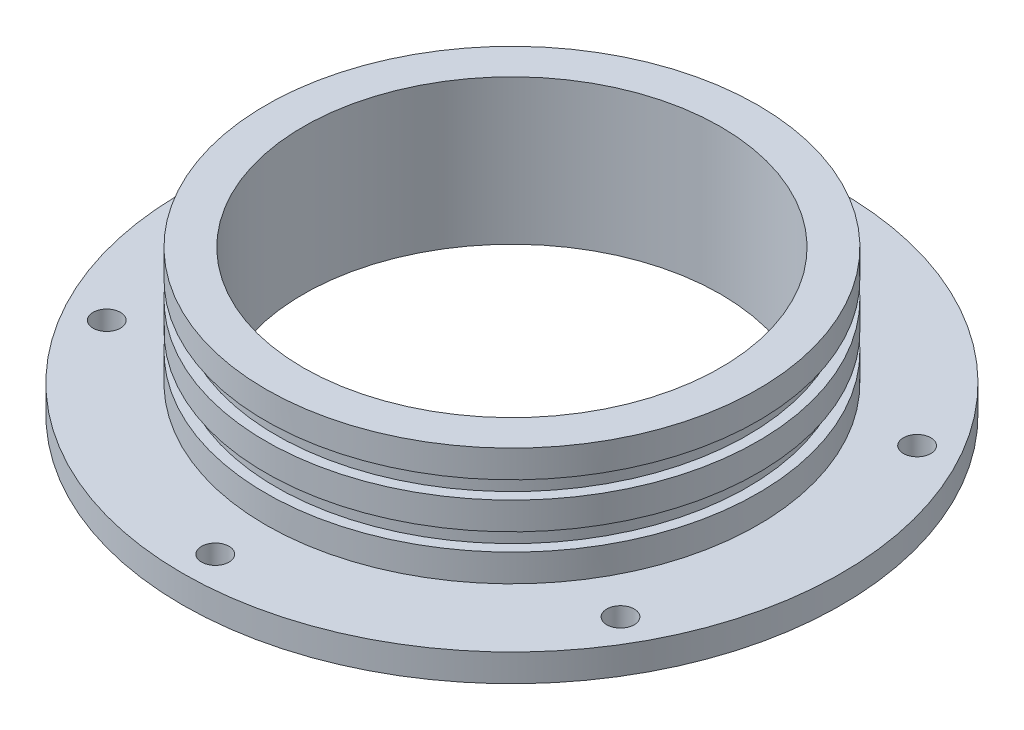
ISO-10303-21;
HEADER;
FILE_DESCRIPTION(('STEP AP214'),'2;1');
FILE_NAME('part.step','',(''),(''),'','','');
FILE_SCHEMA(('AUTOMOTIVE_DESIGN { 1 0 10303 214 1 1 1 1 }'));
ENDSEC;
DATA;
#1=APPLICATION_CONTEXT('core data for automotive mechanical design processes');
#2=APPLICATION_PROTOCOL_DEFINITION('international standard','automotive_design',2000,#1);
#3=PRODUCT_CONTEXT('',#1,'mechanical');
#4=PRODUCT('Part','Part','',(#3));
#5=PRODUCT_RELATED_PRODUCT_CATEGORY('part','',(#4));
#6=PRODUCT_DEFINITION_FORMATION('','',#4);
#7=PRODUCT_DEFINITION_CONTEXT('part definition',#1,'design');
#8=PRODUCT_DEFINITION('design','',#6,#7);
#9=PRODUCT_DEFINITION_SHAPE('','',#8);
#10=(LENGTH_UNIT() NAMED_UNIT(*) SI_UNIT(.MILLI.,.METRE.));
#11=(NAMED_UNIT(*) PLANE_ANGLE_UNIT() SI_UNIT($,.RADIAN.));
#12=(NAMED_UNIT(*) SI_UNIT($,.STERADIAN.) SOLID_ANGLE_UNIT());
#13=UNCERTAINTY_MEASURE_WITH_UNIT(LENGTH_MEASURE(1.E-05),#10,'distance_accuracy_value','');
#14=(GEOMETRIC_REPRESENTATION_CONTEXT(3) GLOBAL_UNCERTAINTY_ASSIGNED_CONTEXT((#13)) GLOBAL_UNIT_ASSIGNED_CONTEXT((#10,
#11,#12)) REPRESENTATION_CONTEXT('',''));
#15=CARTESIAN_POINT('',(0.,0.,0.));
#16=DIRECTION('',(0.,0.,1.));
#17=DIRECTION('',(1.,0.,0.));
#18=AXIS2_PLACEMENT_3D('',#15,#16,#17);
#19=CARTESIAN_POINT('',(0.,26.4,0.));
#20=DIRECTION('',(0.,-1.,0.));
#21=DIRECTION('',(0.,0.,-1.));
#22=AXIS2_PLACEMENT_3D('',#19,#20,#21);
#23=CYLINDRICAL_SURFACE('',#22,44.8);
#24=CARTESIAN_POINT('',(0.,10.,0.));
#25=DIRECTION('',(0.,-1.,0.));
#26=DIRECTION('',(0.,0.,-1.));
#27=AXIS2_PLACEMENT_3D('',#24,#25,#26);
#28=CIRCLE('',#27,44.8);
#29=CARTESIAN_POINT('',(0.,10.,-44.8));
#30=VERTEX_POINT('',#29);
#31=EDGE_CURVE('E48',#30,#30,#28,.T.);
#32=ORIENTED_EDGE('',*,*,#31,.T.);
#33=EDGE_LOOP('',(#32));
#34=FACE_BOUND('',#33,.T.);
#35=CARTESIAN_POINT('',(0.,5.,0.));
#36=DIRECTION('',(0.,1.,0.));
#37=DIRECTION('',(0.,0.,1.));
#38=AXIS2_PLACEMENT_3D('',#35,#36,#37);
#39=CIRCLE('',#38,44.8);
#40=CARTESIAN_POINT('',(0.,5.,44.8));
#41=VERTEX_POINT('',#40);
#42=EDGE_CURVE('E67',#41,#41,#39,.T.);
#43=ORIENTED_EDGE('',*,*,#42,.T.);
#44=EDGE_LOOP('',(#43));
#45=FACE_BOUND('',#44,.T.);
#46=ADVANCED_FACE('F44',(#34,#45),#23,.T.);
#47=CARTESIAN_POINT('',(0.,26.4,0.));
#48=DIRECTION('',(0.,1.,0.));
#49=DIRECTION('',(0.,0.,1.));
#50=AXIS2_PLACEMENT_3D('',#47,#48,#49);
#51=CIRCLE('',#50,44.8);
#52=CARTESIAN_POINT('',(0.,26.4,44.8));
#53=VERTEX_POINT('',#52);
#54=EDGE_CURVE('E81',#53,#53,#51,.T.);
#55=ORIENTED_EDGE('',*,*,#54,.F.);
#56=EDGE_LOOP('',(#55));
#57=FACE_BOUND('',#56,.T.);
#58=CARTESIAN_POINT('',(0.,21.4,0.));
#59=DIRECTION('',(0.,-1.,0.));
#60=DIRECTION('',(0.,0.,-1.));
#61=AXIS2_PLACEMENT_3D('',#58,#59,#60);
#62=CIRCLE('',#61,44.8);
#63=CARTESIAN_POINT('',(0.,21.4,-44.8));
#64=VERTEX_POINT('',#63);
#65=EDGE_CURVE('E61',#64,#64,#62,.T.);
#66=ORIENTED_EDGE('',*,*,#65,.F.);
#67=EDGE_LOOP('',(#66));
#68=FACE_BOUND('',#67,.T.);
#69=ADVANCED_FACE('F90',(#57,#68),#23,.T.);
#70=CARTESIAN_POINT('',(0.,5.,0.));
#71=DIRECTION('',(0.,1.,0.));
#72=DIRECTION('',(0.,0.,1.));
#73=AXIS2_PLACEMENT_3D('',#70,#71,#72);
#74=PLANE('',#73);
#75=CARTESIAN_POINT('',(0.,5.,54.));
#76=DIRECTION('',(0.,1.,0.));
#77=DIRECTION('',(0.,0.,1.));
#78=AXIS2_PLACEMENT_3D('',#75,#76,#77);
#79=CIRCLE('',#78,2.5);
#80=CARTESIAN_POINT('',(0.,5.,56.5));
#81=VERTEX_POINT('',#80);
#82=EDGE_CURVE('E137',#81,#81,#79,.T.);
#83=ORIENTED_EDGE('',*,*,#82,.F.);
#84=EDGE_LOOP('',(#83));
#85=FACE_BOUND('',#84,.T.);
#86=CARTESIAN_POINT('',(46.7653718043612,5.,27.0000000000027));
#87=DIRECTION('',(0.,1.,0.));
#88=DIRECTION('',(0.,0.,1.));
#89=AXIS2_PLACEMENT_3D('',#86,#87,#88);
#90=CIRCLE('',#89,2.50000000000083);
#91=CARTESIAN_POINT('',(46.7653718043612,5.,29.5000000000035));
#92=VERTEX_POINT('',#91);
#93=EDGE_CURVE('E140',#92,#92,#90,.T.);
#94=ORIENTED_EDGE('',*,*,#93,.F.);
#95=EDGE_LOOP('',(#94));
#96=FACE_BOUND('',#95,.T.);
#97=CARTESIAN_POINT('',(46.7653718043643,5.,-26.9999999999973));
#98=DIRECTION('',(0.,1.,0.));
#99=DIRECTION('',(0.,0.,1.));
#100=AXIS2_PLACEMENT_3D('',#97,#98,#99);
#101=CIRCLE('',#100,2.50000000000387);
#102=CARTESIAN_POINT('',(46.7653718043643,5.,-24.4999999999935));
#103=VERTEX_POINT('',#102);
#104=EDGE_CURVE('E143',#103,#103,#101,.T.);
#105=ORIENTED_EDGE('',*,*,#104,.F.);
#106=EDGE_LOOP('',(#105));
#107=FACE_BOUND('',#106,.T.);
#108=CARTESIAN_POINT('',(6.12586305153647E-12,5.,-54.));
#109=DIRECTION('',(0.,1.,0.));
#110=DIRECTION('',(0.,0.,1.));
#111=AXIS2_PLACEMENT_3D('',#108,#109,#110);
#112=CIRCLE('',#111,2.50000000000622);
#113=CARTESIAN_POINT('',(6.12586305153647E-12,5.,-51.4999999999938));
#114=VERTEX_POINT('',#113);
#115=EDGE_CURVE('E146',#114,#114,#112,.T.);
#116=ORIENTED_EDGE('',*,*,#115,.F.);
#117=EDGE_LOOP('',(#116));
#118=FACE_BOUND('',#117,.T.);
#119=CARTESIAN_POINT('',(-46.7653718043551,5.,-27.0000000000027));
#120=DIRECTION('',(0.,1.,0.));
#121=DIRECTION('',(0.,0.,1.));
#122=AXIS2_PLACEMENT_3D('',#119,#120,#121);
#123=CIRCLE('',#122,2.50000000000566);
#124=CARTESIAN_POINT('',(-46.7653718043551,5.,-24.499999999997));
#125=VERTEX_POINT('',#124);
#126=EDGE_CURVE('E149',#125,#125,#123,.T.);
#127=ORIENTED_EDGE('',*,*,#126,.F.);
#128=EDGE_LOOP('',(#127));
#129=FACE_BOUND('',#128,.T.);
#130=CARTESIAN_POINT('',(-46.7653718043582,5.,26.9999999999973));
#131=DIRECTION('',(0.,1.,0.));
#132=DIRECTION('',(0.,0.,1.));
#133=AXIS2_PLACEMENT_3D('',#130,#131,#132);
#134=CIRCLE('',#133,2.50000000000288);
#135=CARTESIAN_POINT('',(-46.7653718043582,5.,29.5000000000002));
#136=VERTEX_POINT('',#135);
#137=EDGE_CURVE('E152',#136,#136,#134,.T.);
#138=ORIENTED_EDGE('',*,*,#137,.F.);
#139=EDGE_LOOP('',(#138));
#140=FACE_BOUND('',#139,.T.);
#141=ORIENTED_EDGE('',*,*,#42,.F.);
#142=EDGE_LOOP('',(#141));
#143=FACE_BOUND('',#142,.T.);
#144=CARTESIAN_POINT('',(0.,5.,0.));
#145=DIRECTION('',(0.,1.,0.));
#146=DIRECTION('',(0.,0.,1.));
#147=AXIS2_PLACEMENT_3D('',#144,#145,#146);
#148=CIRCLE('',#147,60.);
#149=CARTESIAN_POINT('',(0.,5.,60.));
#150=VERTEX_POINT('',#149);
#151=EDGE_CURVE('E12',#150,#150,#148,.T.);
#152=ORIENTED_EDGE('',*,*,#151,.T.);
#153=EDGE_LOOP('',(#152));
#154=FACE_BOUND('',#153,.T.);
#155=ADVANCED_FACE('F87',(#85,#96,#107,#118,#129,#140,#143,#154),#74,.T.);
#156=CARTESIAN_POINT('',(0.,0.,0.));
#157=DIRECTION('',(0.,1.,0.));
#158=DIRECTION('',(0.,0.,1.));
#159=AXIS2_PLACEMENT_3D('',#156,#157,#158);
#160=PLANE('',#159);
#161=CARTESIAN_POINT('',(0.,0.,54.));
#162=DIRECTION('',(0.,-1.,0.));
#163=DIRECTION('',(0.,0.,-1.));
#164=AXIS2_PLACEMENT_3D('',#161,#162,#163);
#165=CIRCLE('',#164,2.5);
#166=CARTESIAN_POINT('',(0.,0.,51.5));
#167=VERTEX_POINT('',#166);
#168=EDGE_CURVE('E159',#167,#167,#165,.T.);
#169=ORIENTED_EDGE('',*,*,#168,.F.);
#170=EDGE_LOOP('',(#169));
#171=FACE_BOUND('',#170,.T.);
#172=CARTESIAN_POINT('',(46.7653718043612,0.,27.0000000000027));
#173=DIRECTION('',(0.,-1.,0.));
#174=DIRECTION('',(0.,0.,-1.));
#175=AXIS2_PLACEMENT_3D('',#172,#173,#174);
#176=CIRCLE('',#175,2.50000000000083);
#177=CARTESIAN_POINT('',(46.7653718043612,0.,24.5000000000018));
#178=VERTEX_POINT('',#177);
#179=EDGE_CURVE('E162',#178,#178,#176,.T.);
#180=ORIENTED_EDGE('',*,*,#179,.F.);
#181=EDGE_LOOP('',(#180));
#182=FACE_BOUND('',#181,.T.);
#183=CARTESIAN_POINT('',(46.7653718043643,0.,-26.9999999999973));
#184=DIRECTION('',(0.,-1.,0.));
#185=DIRECTION('',(0.,0.,-1.));
#186=AXIS2_PLACEMENT_3D('',#183,#184,#185);
#187=CIRCLE('',#186,2.50000000000387);
#188=CARTESIAN_POINT('',(46.7653718043643,0.,-29.5000000000012));
#189=VERTEX_POINT('',#188);
#190=EDGE_CURVE('E165',#189,#189,#187,.T.);
#191=ORIENTED_EDGE('',*,*,#190,.F.);
#192=EDGE_LOOP('',(#191));
#193=FACE_BOUND('',#192,.T.);
#194=CARTESIAN_POINT('',(6.12586305153647E-12,0.,-54.));
#195=DIRECTION('',(0.,-1.,0.));
#196=DIRECTION('',(0.,0.,-1.));
#197=AXIS2_PLACEMENT_3D('',#194,#195,#196);
#198=CIRCLE('',#197,2.50000000000622);
#199=CARTESIAN_POINT('',(6.12586305153647E-12,0.,-56.5000000000062));
#200=VERTEX_POINT('',#199);
#201=EDGE_CURVE('E168',#200,#200,#198,.T.);
#202=ORIENTED_EDGE('',*,*,#201,.F.);
#203=EDGE_LOOP('',(#202));
#204=FACE_BOUND('',#203,.T.);
#205=CARTESIAN_POINT('',(-46.7653718043551,0.,-27.0000000000027));
#206=DIRECTION('',(0.,-1.,0.));
#207=DIRECTION('',(0.,0.,-1.));
#208=AXIS2_PLACEMENT_3D('',#205,#206,#207);
#209=CIRCLE('',#208,2.50000000000566);
#210=CARTESIAN_POINT('',(-46.7653718043551,0.,-29.5000000000083));
#211=VERTEX_POINT('',#210);
#212=EDGE_CURVE('E158',#211,#211,#209,.T.);
#213=ORIENTED_EDGE('',*,*,#212,.F.);
#214=EDGE_LOOP('',(#213));
#215=FACE_BOUND('',#214,.T.);
#216=CARTESIAN_POINT('',(-46.7653718043582,0.,26.9999999999973));
#217=DIRECTION('',(0.,-1.,0.));
#218=DIRECTION('',(0.,0.,-1.));
#219=AXIS2_PLACEMENT_3D('',#216,#217,#218);
#220=CIRCLE('',#219,2.50000000000288);
#221=CARTESIAN_POINT('',(-46.7653718043582,0.,24.4999999999944));
#222=VERTEX_POINT('',#221);
#223=EDGE_CURVE('E155',#222,#222,#220,.T.);
#224=ORIENTED_EDGE('',*,*,#223,.F.);
#225=EDGE_LOOP('',(#224));
#226=FACE_BOUND('',#225,.T.);
#227=CARTESIAN_POINT('',(0.,0.,0.));
#228=DIRECTION('',(0.,1.,0.));
#229=DIRECTION('',(0.,0.,1.));
#230=AXIS2_PLACEMENT_3D('',#227,#228,#229);
#231=CIRCLE('',#230,60.);
#232=CARTESIAN_POINT('',(0.,0.,60.));
#233=VERTEX_POINT('',#232);
#234=EDGE_CURVE('E52',#233,#233,#231,.T.);
#235=ORIENTED_EDGE('',*,*,#234,.F.);
#236=EDGE_LOOP('',(#235));
#237=FACE_BOUND('',#236,.T.);
#238=CARTESIAN_POINT('',(0.,0.,0.));
#239=DIRECTION('',(0.,1.,0.));
#240=DIRECTION('',(0.,0.,1.));
#241=AXIS2_PLACEMENT_3D('',#238,#239,#240);
#242=CIRCLE('',#241,38.);
#243=CARTESIAN_POINT('',(0.,0.,38.));
#244=VERTEX_POINT('',#243);
#245=EDGE_CURVE('E57',#244,#244,#242,.T.);
#246=ORIENTED_EDGE('',*,*,#245,.T.);
#247=EDGE_LOOP('',(#246));
#248=FACE_BOUND('',#247,.T.);
#249=ADVANCED_FACE('F89',(#171,#182,#193,#204,#215,#226,#237,#248),#160,.F.);
#250=CARTESIAN_POINT('',(0.,5.,0.));
#251=DIRECTION('',(0.,-1.,0.));
#252=DIRECTION('',(0.,0.,-1.));
#253=AXIS2_PLACEMENT_3D('',#250,#251,#252);
#254=CYLINDRICAL_SURFACE('',#253,60.);
#255=ORIENTED_EDGE('',*,*,#151,.F.);
#256=EDGE_LOOP('',(#255));
#257=FACE_BOUND('',#256,.T.);
#258=ORIENTED_EDGE('',*,*,#234,.T.);
#259=EDGE_LOOP('',(#258));
#260=FACE_BOUND('',#259,.T.);
#261=ADVANCED_FACE('F46',(#257,#260),#254,.T.);
#262=CARTESIAN_POINT('',(0.,5.,0.));
#263=DIRECTION('',(0.,-1.,0.));
#264=DIRECTION('',(0.,0.,-1.));
#265=AXIS2_PLACEMENT_3D('',#262,#263,#264);
#266=CYLINDRICAL_SURFACE('',#265,38.);
#267=ORIENTED_EDGE('',*,*,#245,.F.);
#268=EDGE_LOOP('',(#267));
#269=FACE_BOUND('',#268,.T.);
#270=CARTESIAN_POINT('',(0.,26.4,0.));
#271=DIRECTION('',(0.,1.,0.));
#272=DIRECTION('',(0.,0.,1.));
#273=AXIS2_PLACEMENT_3D('',#270,#271,#272);
#274=CIRCLE('',#273,38.);
#275=CARTESIAN_POINT('',(0.,26.4,38.));
#276=VERTEX_POINT('',#275);
#277=EDGE_CURVE('E78',#276,#276,#274,.F.);
#278=ORIENTED_EDGE('',*,*,#277,.F.);
#279=EDGE_LOOP('',(#278));
#280=FACE_BOUND('',#279,.T.);
#281=ADVANCED_FACE('F184',(#269,#280),#266,.F.);
#282=CARTESIAN_POINT('',(0.,26.4,0.));
#283=DIRECTION('',(0.,1.,0.));
#284=DIRECTION('',(0.,0.,1.));
#285=AXIS2_PLACEMENT_3D('',#282,#283,#284);
#286=PLANE('',#285);
#287=ORIENTED_EDGE('',*,*,#277,.T.);
#288=EDGE_LOOP('',(#287));
#289=FACE_BOUND('',#288,.T.);
#290=ORIENTED_EDGE('',*,*,#54,.T.);
#291=EDGE_LOOP('',(#290));
#292=FACE_BOUND('',#291,.T.);
#293=ADVANCED_FACE('F187',(#289,#292),#286,.T.);
#294=CARTESIAN_POINT('',(0.,18.2,0.));
#295=DIRECTION('',(0.,1.,0.));
#296=DIRECTION('',(0.,0.,1.));
#297=AXIS2_PLACEMENT_3D('',#294,#295,#296);
#298=PLANE('',#297);
#299=CARTESIAN_POINT('',(0.,18.2,0.));
#300=DIRECTION('',(0.,-1.,0.));
#301=DIRECTION('',(0.,0.,-1.));
#302=AXIS2_PLACEMENT_3D('',#299,#300,#301);
#303=CIRCLE('',#302,42.9);
#304=CARTESIAN_POINT('',(0.,18.2,-42.9));
#305=VERTEX_POINT('',#304);
#306=EDGE_CURVE('E129',#305,#305,#303,.T.);
#307=ORIENTED_EDGE('',*,*,#306,.T.);
#308=EDGE_LOOP('',(#307));
#309=FACE_BOUND('',#308,.T.);
#310=CARTESIAN_POINT('',(0.,18.2,0.));
#311=DIRECTION('',(0.,-1.,0.));
#312=DIRECTION('',(0.,0.,-1.));
#313=AXIS2_PLACEMENT_3D('',#310,#311,#312);
#314=CIRCLE('',#313,44.8);
#315=CARTESIAN_POINT('',(0.,18.2,-44.8));
#316=VERTEX_POINT('',#315);
#317=EDGE_CURVE('E125',#316,#316,#314,.T.);
#318=ORIENTED_EDGE('',*,*,#317,.F.);
#319=EDGE_LOOP('',(#318));
#320=FACE_BOUND('',#319,.T.);
#321=ADVANCED_FACE('F192',(#309,#320),#298,.T.);
#322=CARTESIAN_POINT('',(0.,0.,0.));
#323=DIRECTION('',(0.,-1.,0.));
#324=DIRECTION('',(0.,0.,-1.));
#325=AXIS2_PLACEMENT_3D('',#322,#323,#324);
#326=CYLINDRICAL_SURFACE('',#325,42.9);
#327=CARTESIAN_POINT('',(0.,21.4,0.));
#328=DIRECTION('',(0.,-1.,0.));
#329=DIRECTION('',(0.,0.,-1.));
#330=AXIS2_PLACEMENT_3D('',#327,#328,#329);
#331=CIRCLE('',#330,42.9);
#332=CARTESIAN_POINT('',(0.,21.4,-42.9));
#333=VERTEX_POINT('',#332);
#334=EDGE_CURVE('E134',#333,#333,#331,.T.);
#335=ORIENTED_EDGE('',*,*,#334,.T.);
#336=EDGE_LOOP('',(#335));
#337=FACE_BOUND('',#336,.T.);
#338=ORIENTED_EDGE('',*,*,#306,.F.);
#339=EDGE_LOOP('',(#338));
#340=FACE_BOUND('',#339,.T.);
#341=ADVANCED_FACE('F119',(#337,#340),#326,.T.);
#342=CARTESIAN_POINT('',(0.,21.4,0.));
#343=DIRECTION('',(0.,-1.,0.));
#344=DIRECTION('',(0.,0.,-1.));
#345=AXIS2_PLACEMENT_3D('',#342,#343,#344);
#346=PLANE('',#345);
#347=ORIENTED_EDGE('',*,*,#334,.F.);
#348=EDGE_LOOP('',(#347));
#349=FACE_BOUND('',#348,.T.);
#350=ORIENTED_EDGE('',*,*,#65,.T.);
#351=EDGE_LOOP('',(#350));
#352=FACE_BOUND('',#351,.T.);
#353=ADVANCED_FACE('F111',(#349,#352),#346,.T.);
#354=ORIENTED_EDGE('',*,*,#317,.T.);
#355=EDGE_LOOP('',(#354));
#356=FACE_BOUND('',#355,.T.);
#357=CARTESIAN_POINT('',(0.,13.2,0.));
#358=DIRECTION('',(0.,-1.,0.));
#359=DIRECTION('',(0.,0.,-1.));
#360=AXIS2_PLACEMENT_3D('',#357,#358,#359);
#361=CIRCLE('',#360,44.8);
#362=CARTESIAN_POINT('',(0.,13.2,-44.8));
#363=VERTEX_POINT('',#362);
#364=EDGE_CURVE('E74',#363,#363,#361,.T.);
#365=ORIENTED_EDGE('',*,*,#364,.F.);
#366=EDGE_LOOP('',(#365));
#367=FACE_BOUND('',#366,.T.);
#368=ADVANCED_FACE('F100',(#356,#367),#23,.T.);
#369=CARTESIAN_POINT('',(0.,10.,0.));
#370=DIRECTION('',(0.,-1.,0.));
#371=DIRECTION('',(0.,0.,-1.));
#372=AXIS2_PLACEMENT_3D('',#369,#370,#371);
#373=PLANE('',#372);
#374=CARTESIAN_POINT('',(0.,10.,0.));
#375=DIRECTION('',(0.,-1.,0.));
#376=DIRECTION('',(0.,0.,-1.));
#377=AXIS2_PLACEMENT_3D('',#374,#375,#376);
#378=CIRCLE('',#377,42.9);
#379=CARTESIAN_POINT('',(0.,10.,-42.9));
#380=VERTEX_POINT('',#379);
#381=EDGE_CURVE('E63',#380,#380,#378,.T.);
#382=ORIENTED_EDGE('',*,*,#381,.T.);
#383=EDGE_LOOP('',(#382));
#384=FACE_BOUND('',#383,.T.);
#385=ORIENTED_EDGE('',*,*,#31,.F.);
#386=EDGE_LOOP('',(#385));
#387=FACE_BOUND('',#386,.T.);
#388=ADVANCED_FACE('F110',(#384,#387),#373,.F.);
#389=CARTESIAN_POINT('',(0.,0.,0.));
#390=DIRECTION('',(0.,-1.,0.));
#391=DIRECTION('',(0.,0.,-1.));
#392=AXIS2_PLACEMENT_3D('',#389,#390,#391);
#393=CYLINDRICAL_SURFACE('',#392,42.9);
#394=CARTESIAN_POINT('',(0.,13.2,0.));
#395=DIRECTION('',(0.,-1.,0.));
#396=DIRECTION('',(0.,0.,-1.));
#397=AXIS2_PLACEMENT_3D('',#394,#395,#396);
#398=CIRCLE('',#397,42.9);
#399=CARTESIAN_POINT('',(0.,13.2,-42.9));
#400=VERTEX_POINT('',#399);
#401=EDGE_CURVE('E69',#400,#400,#398,.T.);
#402=ORIENTED_EDGE('',*,*,#401,.T.);
#403=EDGE_LOOP('',(#402));
#404=FACE_BOUND('',#403,.T.);
#405=ORIENTED_EDGE('',*,*,#381,.F.);
#406=EDGE_LOOP('',(#405));
#407=FACE_BOUND('',#406,.T.);
#408=ADVANCED_FACE('F117',(#404,#407),#393,.T.);
#409=CARTESIAN_POINT('',(0.,13.2,0.));
#410=DIRECTION('',(0.,-1.,0.));
#411=DIRECTION('',(0.,0.,-1.));
#412=AXIS2_PLACEMENT_3D('',#409,#410,#411);
#413=PLANE('',#412);
#414=ORIENTED_EDGE('',*,*,#364,.T.);
#415=EDGE_LOOP('',(#414));
#416=FACE_BOUND('',#415,.T.);
#417=ORIENTED_EDGE('',*,*,#401,.F.);
#418=EDGE_LOOP('',(#417));
#419=FACE_BOUND('',#418,.T.);
#420=ADVANCED_FACE('F203',(#416,#419),#413,.T.);
#421=CARTESIAN_POINT('',(-46.7653718043582,20.,26.9999999999973));
#422=DIRECTION('',(0.,-1.,0.));
#423=DIRECTION('',(0.,0.,-1.));
#424=AXIS2_PLACEMENT_3D('',#421,#422,#423);
#425=CYLINDRICAL_SURFACE('',#424,2.50000000000288);
#426=ORIENTED_EDGE('',*,*,#137,.T.);
#427=EDGE_LOOP('',(#426));
#428=FACE_BOUND('',#427,.T.);
#429=ORIENTED_EDGE('',*,*,#223,.T.);
#430=EDGE_LOOP('',(#429));
#431=FACE_BOUND('',#430,.T.);
#432=ADVANCED_FACE('F206',(#428,#431),#425,.F.);
#433=CARTESIAN_POINT('',(-46.7653718043551,20.,-27.0000000000027));
#434=DIRECTION('',(0.,-1.,0.));
#435=DIRECTION('',(0.,0.,-1.));
#436=AXIS2_PLACEMENT_3D('',#433,#434,#435);
#437=CYLINDRICAL_SURFACE('',#436,2.50000000000566);
#438=ORIENTED_EDGE('',*,*,#126,.T.);
#439=EDGE_LOOP('',(#438));
#440=FACE_BOUND('',#439,.T.);
#441=ORIENTED_EDGE('',*,*,#212,.T.);
#442=EDGE_LOOP('',(#441));
#443=FACE_BOUND('',#442,.T.);
#444=ADVANCED_FACE('F174',(#440,#443),#437,.F.);
#445=CARTESIAN_POINT('',(6.12586305153647E-12,20.,-54.));
#446=DIRECTION('',(0.,-1.,0.));
#447=DIRECTION('',(0.,0.,-1.));
#448=AXIS2_PLACEMENT_3D('',#445,#446,#447);
#449=CYLINDRICAL_SURFACE('',#448,2.50000000000622);
#450=ORIENTED_EDGE('',*,*,#115,.T.);
#451=EDGE_LOOP('',(#450));
#452=FACE_BOUND('',#451,.T.);
#453=ORIENTED_EDGE('',*,*,#201,.T.);
#454=EDGE_LOOP('',(#453));
#455=FACE_BOUND('',#454,.T.);
#456=ADVANCED_FACE('F225',(#452,#455),#449,.F.);
#457=CARTESIAN_POINT('',(46.7653718043643,20.,-26.9999999999973));
#458=DIRECTION('',(0.,-1.,0.));
#459=DIRECTION('',(0.,0.,-1.));
#460=AXIS2_PLACEMENT_3D('',#457,#458,#459);
#461=CYLINDRICAL_SURFACE('',#460,2.50000000000387);
#462=ORIENTED_EDGE('',*,*,#104,.T.);
#463=EDGE_LOOP('',(#462));
#464=FACE_BOUND('',#463,.T.);
#465=ORIENTED_EDGE('',*,*,#190,.T.);
#466=EDGE_LOOP('',(#465));
#467=FACE_BOUND('',#466,.T.);
#468=ADVANCED_FACE('F221',(#464,#467),#461,.F.);
#469=CARTESIAN_POINT('',(46.7653718043612,20.,27.0000000000027));
#470=DIRECTION('',(0.,-1.,0.));
#471=DIRECTION('',(0.,0.,-1.));
#472=AXIS2_PLACEMENT_3D('',#469,#470,#471);
#473=CYLINDRICAL_SURFACE('',#472,2.50000000000083);
#474=ORIENTED_EDGE('',*,*,#93,.T.);
#475=EDGE_LOOP('',(#474));
#476=FACE_BOUND('',#475,.T.);
#477=ORIENTED_EDGE('',*,*,#179,.T.);
#478=EDGE_LOOP('',(#477));
#479=FACE_BOUND('',#478,.T.);
#480=ADVANCED_FACE('F217',(#476,#479),#473,.F.);
#481=CARTESIAN_POINT('',(0.,20.,54.));
#482=DIRECTION('',(0.,-1.,0.));
#483=DIRECTION('',(0.,0.,-1.));
#484=AXIS2_PLACEMENT_3D('',#481,#482,#483);
#485=CYLINDRICAL_SURFACE('',#484,2.5);
#486=ORIENTED_EDGE('',*,*,#82,.T.);
#487=EDGE_LOOP('',(#486));
#488=FACE_BOUND('',#487,.T.);
#489=ORIENTED_EDGE('',*,*,#168,.T.);
#490=EDGE_LOOP('',(#489));
#491=FACE_BOUND('',#490,.T.);
#492=ADVANCED_FACE('F214',(#488,#491),#485,.F.);
#493=CLOSED_SHELL('',(#46,#69,#155,#249,#261,#281,#293,#321,#341,#353,#368,#388,#408,#420,#432,
#444,#456,#468,#480,#492));
#494=MANIFOLD_SOLID_BREP('B2',#493);
#495=ADVANCED_BREP_SHAPE_REPRESENTATION('',(#18,#494),#14);
#496=SHAPE_DEFINITION_REPRESENTATION(#9,#495);
ENDSEC;
END-ISO-10303-21;
